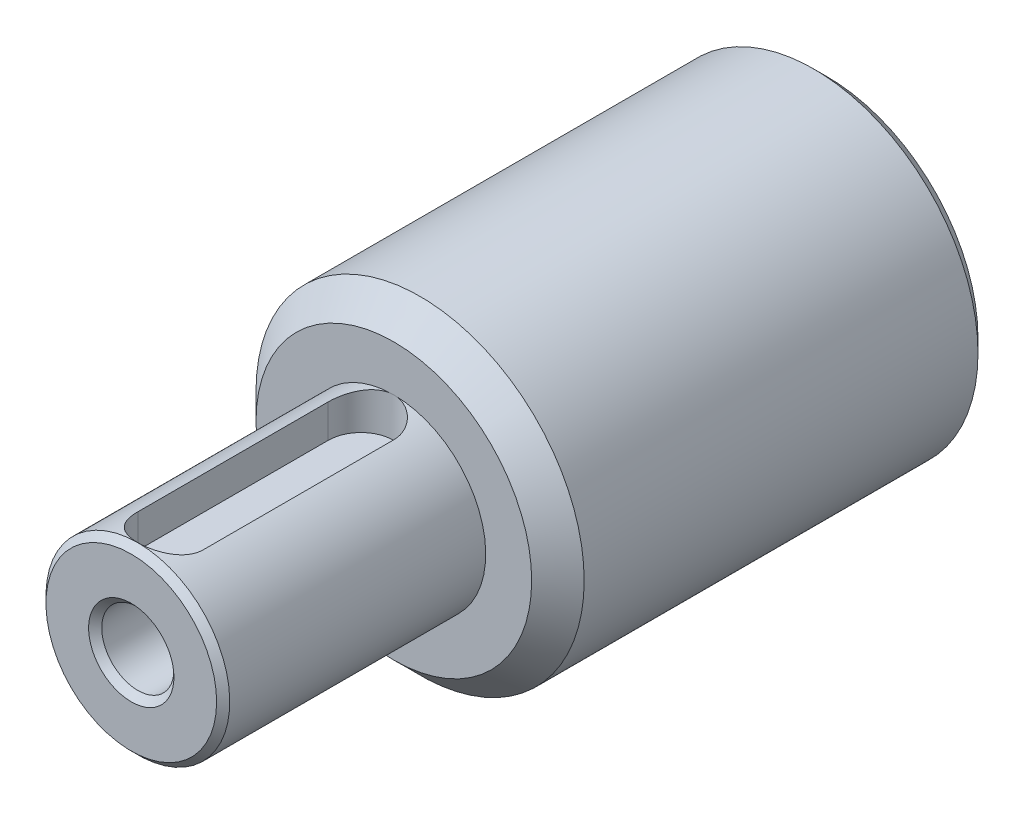
ISO-10303-21;
HEADER;
FILE_DESCRIPTION(('STEP AP214'),'2;1');
FILE_NAME('part.step','',(''),(''),'','','');
FILE_SCHEMA(('AUTOMOTIVE_DESIGN { 1 0 10303 214 1 1 1 1 }'));
ENDSEC;
DATA;
#1=APPLICATION_CONTEXT('core data for automotive mechanical design processes');
#2=APPLICATION_PROTOCOL_DEFINITION('international standard','automotive_design',2000,#1);
#3=PRODUCT_CONTEXT('',#1,'mechanical');
#4=PRODUCT('Part','Part','',(#3));
#5=PRODUCT_RELATED_PRODUCT_CATEGORY('part','',(#4));
#6=PRODUCT_DEFINITION_FORMATION('','',#4);
#7=PRODUCT_DEFINITION_CONTEXT('part definition',#1,'design');
#8=PRODUCT_DEFINITION('design','',#6,#7);
#9=PRODUCT_DEFINITION_SHAPE('','',#8);
#10=(LENGTH_UNIT() NAMED_UNIT(*) SI_UNIT(.MILLI.,.METRE.));
#11=(NAMED_UNIT(*) PLANE_ANGLE_UNIT() SI_UNIT($,.RADIAN.));
#12=(NAMED_UNIT(*) SI_UNIT($,.STERADIAN.) SOLID_ANGLE_UNIT());
#13=UNCERTAINTY_MEASURE_WITH_UNIT(LENGTH_MEASURE(1.E-05),#10,'distance_accuracy_value','');
#14=(GEOMETRIC_REPRESENTATION_CONTEXT(3) GLOBAL_UNCERTAINTY_ASSIGNED_CONTEXT((#13)) GLOBAL_UNIT_ASSIGNED_CONTEXT((#10,
#11,#12)) REPRESENTATION_CONTEXT('',''));
#15=CARTESIAN_POINT('',(0.,0.,0.));
#16=DIRECTION('',(0.,0.,1.));
#17=DIRECTION('',(1.,0.,0.));
#18=AXIS2_PLACEMENT_3D('',#15,#16,#17);
#19=CARTESIAN_POINT('',(0.,0.,33.));
#20=DIRECTION('',(0.,0.,1.));
#21=DIRECTION('',(1.,0.,0.));
#22=AXIS2_PLACEMENT_3D('',#19,#20,#21);
#23=PLANE('',#22);
#24=CARTESIAN_POINT('',(0.,0.,33.));
#25=DIRECTION('',(0.,0.,1.));
#26=DIRECTION('',(1.,0.,0.));
#27=AXIS2_PLACEMENT_3D('',#24,#25,#26);
#28=CIRCLE('',#27,10.5);
#29=CARTESIAN_POINT('',(10.5,0.,33.));
#30=VERTEX_POINT('',#29);
#31=EDGE_CURVE('E172',#30,#30,#28,.T.);
#32=ORIENTED_EDGE('',*,*,#31,.T.);
#33=EDGE_LOOP('',(#32));
#34=FACE_BOUND('',#33,.T.);
#35=CARTESIAN_POINT('',(0.,0.,33.));
#36=DIRECTION('',(0.,0.,1.));
#37=DIRECTION('',(1.,0.,0.));
#38=AXIS2_PLACEMENT_3D('',#35,#36,#37);
#39=CIRCLE('',#38,7.);
#40=CARTESIAN_POINT('',(0.,7.,33.));
#41=VERTEX_POINT('',#40);
#42=EDGE_CURVE('E161',#41,#41,#39,.T.);
#43=ORIENTED_EDGE('',*,*,#42,.F.);
#44=EDGE_LOOP('',(#43));
#45=FACE_BOUND('',#44,.T.);
#46=ADVANCED_FACE('F36',(#34,#45),#23,.T.);
#47=CARTESIAN_POINT('',(0.,0.,33.));
#48=DIRECTION('',(0.,0.,-1.));
#49=DIRECTION('',(-1.,0.,0.));
#50=AXIS2_PLACEMENT_3D('',#47,#48,#49);
#51=CYLINDRICAL_SURFACE('',#50,12.5);
#52=CARTESIAN_POINT('',(0.,0.,0.999999999999987));
#53=DIRECTION('',(0.,0.,1.));
#54=DIRECTION('',(1.,0.,0.));
#55=AXIS2_PLACEMENT_3D('',#52,#53,#54);
#56=CIRCLE('',#55,12.5);
#57=CARTESIAN_POINT('',(12.5,0.,0.999999999999987));
#58=VERTEX_POINT('',#57);
#59=EDGE_CURVE('E310',#58,#58,#56,.T.);
#60=ORIENTED_EDGE('',*,*,#59,.T.);
#61=EDGE_LOOP('',(#60));
#62=FACE_BOUND('',#61,.T.);
#63=CARTESIAN_POINT('',(0.,0.,31.));
#64=DIRECTION('',(0.,0.,1.));
#65=DIRECTION('',(1.,0.,0.));
#66=AXIS2_PLACEMENT_3D('',#63,#64,#65);
#67=CIRCLE('',#66,12.5);
#68=CARTESIAN_POINT('',(12.5,0.,31.));
#69=VERTEX_POINT('',#68);
#70=EDGE_CURVE('E175',#69,#69,#67,.F.);
#71=ORIENTED_EDGE('',*,*,#70,.T.);
#72=EDGE_LOOP('',(#71));
#73=FACE_BOUND('',#72,.T.);
#74=ADVANCED_FACE('F229',(#62,#73),#51,.T.);
#75=CARTESIAN_POINT('',(0.,0.,0.));
#76=DIRECTION('',(0.,0.,1.));
#77=DIRECTION('',(1.,0.,0.));
#78=AXIS2_PLACEMENT_3D('',#75,#76,#77);
#79=PLANE('',#78);
#80=DIRECTION('',(0.,1.,0.));
#81=VECTOR('',#80,1.);
#82=CARTESIAN_POINT('',(-2.5,9.,0.));
#83=LINE('',#82,#81);
#84=CARTESIAN_POINT('',(-2.5,7.07106781186547,0.));
#85=VERTEX_POINT('',#84);
#86=CARTESIAN_POINT('',(-2.5,9.,0.));
#87=VERTEX_POINT('',#86);
#88=EDGE_CURVE('E127',#85,#87,#83,.T.);
#89=ORIENTED_EDGE('',*,*,#88,.F.);
#90=CARTESIAN_POINT('',(0.,0.,0.));
#91=DIRECTION('',(0.,0.,1.));
#92=DIRECTION('',(1.,0.,0.));
#93=AXIS2_PLACEMENT_3D('',#90,#91,#92);
#94=CIRCLE('',#93,7.5);
#95=CARTESIAN_POINT('',(2.5,7.07106781186548,0.));
#96=VERTEX_POINT('',#95);
#97=EDGE_CURVE('E51',#85,#96,#94,.T.);
#98=ORIENTED_EDGE('',*,*,#97,.T.);
#99=DIRECTION('',(0.,-1.,0.));
#100=VECTOR('',#99,1.);
#101=CARTESIAN_POINT('',(2.5,9.,0.));
#102=LINE('',#101,#100);
#103=CARTESIAN_POINT('',(2.5,9.,0.));
#104=VERTEX_POINT('',#103);
#105=EDGE_CURVE('E138',#104,#96,#102,.T.);
#106=ORIENTED_EDGE('',*,*,#105,.F.);
#107=DIRECTION('',(1.,0.,0.));
#108=VECTOR('',#107,1.);
#109=CARTESIAN_POINT('',(2.5,9.,0.));
#110=LINE('',#109,#108);
#111=EDGE_CURVE('E142',#87,#104,#110,.T.);
#112=ORIENTED_EDGE('',*,*,#111,.F.);
#113=EDGE_LOOP('',(#89,#98,#106,#112));
#114=FACE_BOUND('',#113,.T.);
#115=CARTESIAN_POINT('',(0.,0.,0.));
#116=DIRECTION('',(0.,0.,1.));
#117=DIRECTION('',(1.,0.,0.));
#118=AXIS2_PLACEMENT_3D('',#115,#116,#117);
#119=CIRCLE('',#118,11.5);
#120=CARTESIAN_POINT('',(11.5,0.,0.));
#121=VERTEX_POINT('',#120);
#122=EDGE_CURVE('E313',#121,#121,#119,.F.);
#123=ORIENTED_EDGE('',*,*,#122,.T.);
#124=EDGE_LOOP('',(#123));
#125=FACE_BOUND('',#124,.T.);
#126=ADVANCED_FACE('F224',(#114,#125),#79,.F.);
#127=CARTESIAN_POINT('',(0.,0.,53.));
#128=DIRECTION('',(0.,0.,-1.));
#129=DIRECTION('',(-1.,0.,0.));
#130=AXIS2_PLACEMENT_3D('',#127,#128,#129);
#131=CYLINDRICAL_SURFACE('',#130,7.);
#132=CARTESIAN_POINT('',(2.5,6.53834841531101,50.));
#133=CARTESIAN_POINT('',(2.50000932220903,6.53833653785133,50.0678892457289));
#134=CARTESIAN_POINT('',(2.49723485076694,6.53940549922738,50.1357719326391));
#135=CARTESIAN_POINT('',(2.4861910211816,6.54361657478134,50.2710039106114));
#136=CARTESIAN_POINT('',(2.47792334551208,6.54675805418062,50.3383533586061));
#137=CARTESIAN_POINT('',(2.456001752859,6.55501217637942,50.4718214146028));
#138=CARTESIAN_POINT('',(2.44236559963955,6.56011831705676,50.5379433363398));
#139=CARTESIAN_POINT('',(2.40985115466648,6.57213177854175,50.6687018351085));
#140=CARTESIAN_POINT('',(2.39097263107435,6.57903917900746,50.7333383463124));
#141=CARTESIAN_POINT('',(2.32673964179204,6.6021493436571,50.9242643664775));
#142=CARTESIAN_POINT('',(2.27375112606986,6.62075475340844,51.0477904521356));
#143=CARTESIAN_POINT('',(2.14910757865425,6.6622539736071,51.284230333128));
#144=CARTESIAN_POINT('',(2.07743895048849,6.68515090424876,51.3971363167355));
#145=CARTESIAN_POINT('',(1.9140257110197,6.73379913792224,51.6142152133527));
#146=CARTESIAN_POINT('',(1.82158337146744,6.75962864041371,51.7178464751959));
#147=CARTESIAN_POINT('',(1.6207338877633,6.81057592323031,51.9085087047164));
#148=CARTESIAN_POINT('',(1.51232377552673,6.83569357019868,51.9955365792434));
#149=CARTESIAN_POINT('',(1.27853915335934,6.88331133279046,52.153089855455));
#150=CARTESIAN_POINT('',(1.15274833789185,6.90570835223797,52.2230315218605));
#151=CARTESIAN_POINT('',(0.890250825476636,6.94442357672633,52.3405366467974));
#152=CARTESIAN_POINT('',(0.753547890540328,6.96074386585465,52.388107779046));
#153=CARTESIAN_POINT('',(0.478829979256176,6.9849105051071,52.4576406021824));
#154=CARTESIAN_POINT('',(0.341079835227467,6.99306594352515,52.4805391304711));
#155=CARTESIAN_POINT('',(0.063464305296903,7.00108798053822,52.5030684027777));
#156=CARTESIAN_POINT('',(-0.0764004845074496,7.00095687302702,52.5027055860347));
#157=CARTESIAN_POINT('',(-0.347593258486948,6.99262258049077,52.4792887262389));
#158=CARTESIAN_POINT('',(-0.479022407078722,6.98478243583516,52.4572552058015));
#159=CARTESIAN_POINT('',(-0.736175812143609,6.96237832507347,52.3928265758412));
#160=CARTESIAN_POINT('',(-0.861899745780465,6.94781397899037,52.3504303156375));
#161=CARTESIAN_POINT('',(-1.10616102429807,6.91316506890369,52.2459530884347));
#162=CARTESIAN_POINT('',(-1.22457279066906,6.89300592164314,52.1836042850399));
#163=CARTESIAN_POINT('',(-1.44953531305523,6.8492335561632,52.0412206647766));
#164=CARTESIAN_POINT('',(-1.55608245176771,6.82561928959263,51.9611804762164));
#165=CARTESIAN_POINT('',(-1.7603244525607,6.7759054780549,51.7806767363433));
#166=CARTESIAN_POINT('',(-1.85724185700418,6.74974055843875,51.6793502768551));
#167=CARTESIAN_POINT('',(-2.03299914621296,6.69890342468975,51.4616726358344));
#168=CARTESIAN_POINT('',(-2.11183255456462,6.67423174765257,51.3453160948315));
#169=CARTESIAN_POINT('',(-2.25049860898459,6.62877803875405,51.098057401478));
#170=CARTESIAN_POINT('',(-2.30994207989625,6.60807875118994,50.9669210244946));
#171=CARTESIAN_POINT('',(-2.4055543972585,6.57388213610267,50.6956351984178));
#172=CARTESIAN_POINT('',(-2.44176119399954,6.56037307165053,50.555500858831));
#173=CARTESIAN_POINT('',(-2.47705497148627,6.54708542245562,50.3449694557358));
#174=CARTESIAN_POINT('',(-2.48565347586445,6.54382010967907,50.2762636982282));
#175=CARTESIAN_POINT('',(-2.49712352174882,6.53944910829676,50.1383848358083));
#176=CARTESIAN_POINT('',(-2.50000139665367,6.53834103140935,50.0692123328995));
#177=CARTESIAN_POINT('',(-2.5,6.53834841531101,50.));
#178=B_SPLINE_CURVE_WITH_KNOTS('',3,(#132,#133,#134,#135,#136,#137,#138,#139,#140,#141,#142,
#143,#144,#145,#146,#147,#148,#149,#150,#151,#152,#153,#154,#155,#156,#157,#158,#159,#160,#161,
#162,#163,#164,#165,#166,#167,#168,#169,#170,#171,#172,#173,#174,#175,#176,#177),.UNSPECIFIED.,
.F.,.F.,(4,2,2,2,2,2,2,2,2,2,2,2,2,2,2,2,2,2,2,2,2,2,4),(0.,0.203591628551592,0.407120929225535,
0.609982356545741,0.812852756635989,1.21793118555512,1.6233052814847,2.0451597231193,
2.4670926781184,2.90188398965561,3.33652604665237,3.75400993940861,4.17137826416923,
4.56998920861347,4.96862268086888,5.3728490944864,5.77719841367921,6.20315837945088,
6.6292706567472,7.06347329058504,7.49696496492444,7.70468580162773,7.91217653896404),.UNSPECIFIED.);
#179=CARTESIAN_POINT('',(2.5,6.53834841531101,50.));
#180=VERTEX_POINT('',#179);
#181=CARTESIAN_POINT('',(-2.71449623025347E-13,7.00000000000099,52.5000000000028));
#182=VERTEX_POINT('',#181);
#183=EDGE_CURVE('E188',#180,#182,#178,.T.);
#184=ORIENTED_EDGE('',*,*,#183,.T.);
#185=CARTESIAN_POINT('',(0.,0.,52.5));
#186=DIRECTION('',(0.,0.,1.));
#187=DIRECTION('',(1.,0.,0.));
#188=AXIS2_PLACEMENT_3D('',#185,#186,#187);
#189=CIRCLE('',#188,7.);
#190=EDGE_CURVE('E307',#182,#182,#189,.F.);
#191=ORIENTED_EDGE('',*,*,#190,.T.);
#192=CARTESIAN_POINT('',(-2.5,6.53834841531101,50.));
#193=VERTEX_POINT('',#192);
#194=EDGE_CURVE('E186',#182,#193,#178,.T.);
#195=ORIENTED_EDGE('',*,*,#194,.T.);
#196=DIRECTION('',(0.,0.,-1.));
#197=VECTOR('',#196,1.);
#198=CARTESIAN_POINT('',(-2.5,6.53834841531101,53.));
#199=LINE('',#198,#197);
#200=CARTESIAN_POINT('',(-2.5,6.53834841531101,35.5));
#201=VERTEX_POINT('',#200);
#202=EDGE_CURVE('E300',#193,#201,#199,.T.);
#203=ORIENTED_EDGE('',*,*,#202,.T.);
#204=CARTESIAN_POINT('',(-2.5,6.53834841531101,35.5));
#205=CARTESIAN_POINT('',(-2.50000932220904,6.53833653785133,35.4321107542711));
#206=CARTESIAN_POINT('',(-2.49723485076694,6.53940549922738,35.3642280673609));
#207=CARTESIAN_POINT('',(-2.4861910211816,6.54361657478134,35.2289960893886));
#208=CARTESIAN_POINT('',(-2.47792334551208,6.54675805418062,35.1616466413939));
#209=CARTESIAN_POINT('',(-2.456001752859,6.55501217637942,35.0281785853972));
#210=CARTESIAN_POINT('',(-2.44236559963955,6.56011831705676,34.9620566636602));
#211=CARTESIAN_POINT('',(-2.40985115466648,6.57213177854175,34.8312981648915));
#212=CARTESIAN_POINT('',(-2.39097263107436,6.57903917900746,34.7666616536876));
#213=CARTESIAN_POINT('',(-2.32673964179205,6.60214934365709,34.5757356335225));
#214=CARTESIAN_POINT('',(-2.27375112606986,6.62075475340844,34.4522095478644));
#215=CARTESIAN_POINT('',(-2.14910757865425,6.6622539736071,34.215769666872));
#216=CARTESIAN_POINT('',(-2.07743895048849,6.68515090424876,34.1028636832645));
#217=CARTESIAN_POINT('',(-1.9140257110197,6.73379913792224,33.8857847866473));
#218=CARTESIAN_POINT('',(-1.82158337146744,6.75962864041371,33.7821535248041));
#219=CARTESIAN_POINT('',(-1.6207338877633,6.81057592323031,33.5914912952836));
#220=CARTESIAN_POINT('',(-1.51232377552674,6.83569357019868,33.5044634207567));
#221=CARTESIAN_POINT('',(-1.27853915335935,6.88331133279046,33.346910144545));
#222=CARTESIAN_POINT('',(-1.15274833789185,6.90570835223797,33.2769684781395));
#223=CARTESIAN_POINT('',(-0.890250825476637,6.94442357672633,33.1594633532026));
#224=CARTESIAN_POINT('',(-0.753547890540329,6.96074386585465,33.111892220954));
#225=CARTESIAN_POINT('',(-0.478829979256176,6.9849105051071,33.0423593978176));
#226=CARTESIAN_POINT('',(-0.341079835227467,6.99306594352515,33.0194608695289));
#227=CARTESIAN_POINT('',(-0.0634643052969033,7.00108798053822,32.9969315972224));
#228=CARTESIAN_POINT('',(0.0764004845074492,7.00095687302702,32.9972944139653));
#229=CARTESIAN_POINT('',(0.347593258486947,6.99262258049077,33.0207112737611));
#230=CARTESIAN_POINT('',(0.479022407078721,6.98478243583516,33.0427447941985));
#231=CARTESIAN_POINT('',(0.736175812143608,6.96237832507347,33.1071734241588));
#232=CARTESIAN_POINT('',(0.861899745780465,6.94781397899037,33.1495696843625));
#233=CARTESIAN_POINT('',(1.10616102429807,6.91316506890369,33.2540469115653));
#234=CARTESIAN_POINT('',(1.22457279066906,6.89300592164314,33.3163957149601));
#235=CARTESIAN_POINT('',(1.44953531305523,6.8492335561632,33.4587793352234));
#236=CARTESIAN_POINT('',(1.55608245176771,6.82561928959263,33.5388195237836));
#237=CARTESIAN_POINT('',(1.7603244525607,6.7759054780549,33.7193232636567));
#238=CARTESIAN_POINT('',(1.85724185700418,6.74974055843875,33.8206497231449));
#239=CARTESIAN_POINT('',(2.03299914621296,6.69890342468975,34.0383273641656));
#240=CARTESIAN_POINT('',(2.11183255456462,6.67423174765257,34.1546839051685));
#241=CARTESIAN_POINT('',(2.25049860898459,6.62877803875405,34.401942598522));
#242=CARTESIAN_POINT('',(2.30994207989626,6.60807875118994,34.5330789755054));
#243=CARTESIAN_POINT('',(2.4055543972585,6.57388213610267,34.8043648015822));
#244=CARTESIAN_POINT('',(2.44176119399954,6.56037307165053,34.944499141169));
#245=CARTESIAN_POINT('',(2.47705497148627,6.54708542245562,35.1550305442642));
#246=CARTESIAN_POINT('',(2.48565347586445,6.54382010967907,35.2237363017718));
#247=CARTESIAN_POINT('',(2.49712352174882,6.53944910829676,35.3616151641917));
#248=CARTESIAN_POINT('',(2.50000139665367,6.53834103140935,35.4307876671005));
#249=CARTESIAN_POINT('',(2.5,6.53834841531101,35.5));
#250=B_SPLINE_CURVE_WITH_KNOTS('',3,(#204,#205,#206,#207,#208,#209,#210,#211,#212,#213,#214,
#215,#216,#217,#218,#219,#220,#221,#222,#223,#224,#225,#226,#227,#228,#229,#230,#231,#232,#233,
#234,#235,#236,#237,#238,#239,#240,#241,#242,#243,#244,#245,#246,#247,#248,#249),.UNSPECIFIED.,
.F.,.F.,(4,2,2,2,2,2,2,2,2,2,2,2,2,2,2,2,2,2,2,2,2,2,4),(0.,0.203591628551592,0.407120929225535,
0.609982356545741,0.812852756635989,1.21793118555512,1.6233052814847,2.0451597231193,
2.4670926781184,2.90188398965561,3.33652604665238,3.75400993940862,4.17137826416923,
4.56998920861347,4.96862268086888,5.37284909448639,5.77719841367922,6.20315837945088,
6.62927065674721,7.06347329058505,7.49696496492445,7.70468580162774,7.91217653896405),.UNSPECIFIED.);
#251=EDGE_CURVE('E187',#201,#41,#250,.T.);
#252=ORIENTED_EDGE('',*,*,#251,.T.);
#253=ORIENTED_EDGE('',*,*,#42,.T.);
#254=CARTESIAN_POINT('',(2.5,6.53834841531101,35.5));
#255=VERTEX_POINT('',#254);
#256=EDGE_CURVE('E178',#41,#255,#250,.T.);
#257=ORIENTED_EDGE('',*,*,#256,.T.);
#258=DIRECTION('',(0.,0.,-1.));
#259=VECTOR('',#258,1.);
#260=CARTESIAN_POINT('',(2.5,6.53834841531101,53.));
#261=LINE('',#260,#259);
#262=EDGE_CURVE('E296',#255,#180,#261,.F.);
#263=ORIENTED_EDGE('',*,*,#262,.T.);
#264=EDGE_LOOP('',(#184,#191,#195,#203,#252,#253,#257,#263));
#265=FACE_BOUND('',#264,.T.);
#266=ADVANCED_FACE('F194',(#265),#131,.T.);
#267=CARTESIAN_POINT('',(0.,0.,53.));
#268=DIRECTION('',(0.,0.,1.));
#269=DIRECTION('',(1.,0.,0.));
#270=AXIS2_PLACEMENT_3D('',#267,#268,#269);
#271=PLANE('',#270);
#272=CARTESIAN_POINT('',(0.,0.,53.));
#273=DIRECTION('',(0.,0.,1.));
#274=DIRECTION('',(1.,0.,0.));
#275=AXIS2_PLACEMENT_3D('',#272,#273,#274);
#276=CIRCLE('',#275,3.25000000000002);
#277=CARTESIAN_POINT('',(3.25000000000002,0.,53.));
#278=VERTEX_POINT('',#277);
#279=EDGE_CURVE('E525',#278,#278,#276,.F.);
#280=ORIENTED_EDGE('',*,*,#279,.T.);
#281=EDGE_LOOP('',(#280));
#282=FACE_BOUND('',#281,.T.);
#283=CARTESIAN_POINT('',(0.,0.,53.));
#284=DIRECTION('',(0.,0.,1.));
#285=DIRECTION('',(1.,0.,0.));
#286=AXIS2_PLACEMENT_3D('',#283,#284,#285);
#287=CIRCLE('',#286,6.50000000000001);
#288=CARTESIAN_POINT('',(6.50000000000001,0.,53.));
#289=VERTEX_POINT('',#288);
#290=EDGE_CURVE('E303',#289,#289,#287,.T.);
#291=ORIENTED_EDGE('',*,*,#290,.T.);
#292=EDGE_LOOP('',(#291));
#293=FACE_BOUND('',#292,.T.);
#294=ADVANCED_FACE('F215',(#282,#293),#271,.T.);
#295=CARTESIAN_POINT('',(0.,0.,33.));
#296=DIRECTION('',(0.,0.,-1.));
#297=DIRECTION('',(-1.,0.,0.));
#298=AXIS2_PLACEMENT_3D('',#295,#296,#297);
#299=CONICAL_SURFACE('',#298,10.5,0.785398163397448);
#300=ORIENTED_EDGE('',*,*,#70,.F.);
#301=EDGE_LOOP('',(#300));
#302=FACE_BOUND('',#301,.T.);
#303=ORIENTED_EDGE('',*,*,#31,.F.);
#304=EDGE_LOOP('',(#303));
#305=FACE_BOUND('',#304,.T.);
#306=ADVANCED_FACE('F213',(#302,#305),#299,.T.);
#307=CARTESIAN_POINT('',(0.,4.,50.));
#308=DIRECTION('',(0.,1.,0.));
#309=DIRECTION('',(0.,0.,1.));
#310=AXIS2_PLACEMENT_3D('',#307,#308,#309);
#311=CYLINDRICAL_SURFACE('',#310,2.5);
#312=DIRECTION('',(0.,1.,0.));
#313=VECTOR('',#312,1.);
#314=CARTESIAN_POINT('',(2.5,4.,50.));
#315=LINE('',#314,#313);
#316=CARTESIAN_POINT('',(2.5,4.,50.));
#317=VERTEX_POINT('',#316);
#318=EDGE_CURVE('E157',#317,#180,#315,.T.);
#319=ORIENTED_EDGE('',*,*,#318,.F.);
#320=CARTESIAN_POINT('',(0.,4.,50.));
#321=DIRECTION('',(0.,1.,0.));
#322=DIRECTION('',(0.,0.,1.));
#323=AXIS2_PLACEMENT_3D('',#320,#321,#322);
#324=CIRCLE('',#323,2.5);
#325=CARTESIAN_POINT('',(-2.5,4.,50.));
#326=VERTEX_POINT('',#325);
#327=EDGE_CURVE('E144',#326,#317,#324,.T.);
#328=ORIENTED_EDGE('',*,*,#327,.F.);
#329=DIRECTION('',(0.,1.,0.));
#330=VECTOR('',#329,1.);
#331=CARTESIAN_POINT('',(-2.5,4.,50.));
#332=LINE('',#331,#330);
#333=EDGE_CURVE('E158',#326,#193,#332,.T.);
#334=ORIENTED_EDGE('',*,*,#333,.T.);
#335=ORIENTED_EDGE('',*,*,#194,.F.);
#336=ORIENTED_EDGE('',*,*,#183,.F.);
#337=EDGE_LOOP('',(#319,#328,#334,#335,#336));
#338=FACE_BOUND('',#337,.T.);
#339=ADVANCED_FACE('F210',(#338),#311,.F.);
#340=CARTESIAN_POINT('',(-2.5,4.,50.));
#341=DIRECTION('',(-1.,0.,0.));
#342=DIRECTION('',(0.,0.,1.));
#343=AXIS2_PLACEMENT_3D('',#340,#341,#342);
#344=PLANE('',#343);
#345=ORIENTED_EDGE('',*,*,#333,.F.);
#346=DIRECTION('',(0.,0.,1.));
#347=VECTOR('',#346,1.);
#348=CARTESIAN_POINT('',(-2.5,4.,50.));
#349=LINE('',#348,#347);
#350=CARTESIAN_POINT('',(-2.5,4.,35.5));
#351=VERTEX_POINT('',#350);
#352=EDGE_CURVE('E154',#351,#326,#349,.T.);
#353=ORIENTED_EDGE('',*,*,#352,.F.);
#354=DIRECTION('',(0.,1.,0.));
#355=VECTOR('',#354,1.);
#356=CARTESIAN_POINT('',(-2.5,4.,35.5));
#357=LINE('',#356,#355);
#358=EDGE_CURVE('E162',#351,#201,#357,.T.);
#359=ORIENTED_EDGE('',*,*,#358,.T.);
#360=ORIENTED_EDGE('',*,*,#202,.F.);
#361=EDGE_LOOP('',(#345,#353,#359,#360));
#362=FACE_BOUND('',#361,.T.);
#363=ADVANCED_FACE('F204',(#362),#344,.F.);
#364=CARTESIAN_POINT('',(0.,4.,35.5));
#365=DIRECTION('',(0.,1.,0.));
#366=DIRECTION('',(0.,0.,1.));
#367=AXIS2_PLACEMENT_3D('',#364,#365,#366);
#368=CYLINDRICAL_SURFACE('',#367,2.5);
#369=ORIENTED_EDGE('',*,*,#358,.F.);
#370=CARTESIAN_POINT('',(0.,4.,35.5));
#371=DIRECTION('',(0.,1.,0.));
#372=DIRECTION('',(0.,0.,1.));
#373=AXIS2_PLACEMENT_3D('',#370,#371,#372);
#374=CIRCLE('',#373,2.5);
#375=CARTESIAN_POINT('',(2.5,4.,35.5));
#376=VERTEX_POINT('',#375);
#377=EDGE_CURVE('E151',#376,#351,#374,.T.);
#378=ORIENTED_EDGE('',*,*,#377,.F.);
#379=DIRECTION('',(0.,1.,0.));
#380=VECTOR('',#379,1.);
#381=CARTESIAN_POINT('',(2.5,4.,35.5));
#382=LINE('',#381,#380);
#383=EDGE_CURVE('E165',#376,#255,#382,.T.);
#384=ORIENTED_EDGE('',*,*,#383,.T.);
#385=ORIENTED_EDGE('',*,*,#256,.F.);
#386=ORIENTED_EDGE('',*,*,#251,.F.);
#387=EDGE_LOOP('',(#369,#378,#384,#385,#386));
#388=FACE_BOUND('',#387,.T.);
#389=ADVANCED_FACE('F198',(#388),#368,.F.);
#390=CARTESIAN_POINT('',(2.5,4.,50.));
#391=DIRECTION('',(1.,0.,0.));
#392=DIRECTION('',(0.,0.,-1.));
#393=AXIS2_PLACEMENT_3D('',#390,#391,#392);
#394=PLANE('',#393);
#395=ORIENTED_EDGE('',*,*,#383,.F.);
#396=DIRECTION('',(0.,0.,-1.));
#397=VECTOR('',#396,1.);
#398=CARTESIAN_POINT('',(2.5,4.,50.));
#399=LINE('',#398,#397);
#400=EDGE_CURVE('E148',#317,#376,#399,.T.);
#401=ORIENTED_EDGE('',*,*,#400,.F.);
#402=ORIENTED_EDGE('',*,*,#318,.T.);
#403=ORIENTED_EDGE('',*,*,#262,.F.);
#404=EDGE_LOOP('',(#395,#401,#402,#403));
#405=FACE_BOUND('',#404,.T.);
#406=ADVANCED_FACE('F203',(#405),#394,.F.);
#407=CARTESIAN_POINT('',(0.,4.,50.));
#408=DIRECTION('',(0.,1.,0.));
#409=DIRECTION('',(0.,0.,1.));
#410=AXIS2_PLACEMENT_3D('',#407,#408,#409);
#411=PLANE('',#410);
#412=ORIENTED_EDGE('',*,*,#327,.T.);
#413=ORIENTED_EDGE('',*,*,#400,.T.);
#414=ORIENTED_EDGE('',*,*,#377,.T.);
#415=ORIENTED_EDGE('',*,*,#352,.T.);
#416=EDGE_LOOP('',(#412,#413,#414,#415));
#417=FACE_BOUND('',#416,.T.);
#418=ADVANCED_FACE('F208',(#417),#411,.T.);
#419=CARTESIAN_POINT('',(0.,0.,53.));
#420=DIRECTION('',(0.,0.,-1.));
#421=DIRECTION('',(-1.,0.,0.));
#422=AXIS2_PLACEMENT_3D('',#419,#420,#421);
#423=CONICAL_SURFACE('',#422,6.50000000000001,0.785398163397449);
#424=ORIENTED_EDGE('',*,*,#190,.F.);
#425=EDGE_LOOP('',(#424));
#426=FACE_BOUND('',#425,.T.);
#427=ORIENTED_EDGE('',*,*,#290,.F.);
#428=EDGE_LOOP('',(#427));
#429=FACE_BOUND('',#428,.T.);
#430=ADVANCED_FACE('F240',(#426,#429),#423,.T.);
#431=CARTESIAN_POINT('',(0.,0.,0.999999999999987));
#432=DIRECTION('',(0.,0.,1.));
#433=DIRECTION('',(1.,0.,0.));
#434=AXIS2_PLACEMENT_3D('',#431,#432,#433);
#435=CONICAL_SURFACE('',#434,12.5,0.785398163397454);
#436=ORIENTED_EDGE('',*,*,#122,.F.);
#437=EDGE_LOOP('',(#436));
#438=FACE_BOUND('',#437,.T.);
#439=ORIENTED_EDGE('',*,*,#59,.F.);
#440=EDGE_LOOP('',(#439));
#441=FACE_BOUND('',#440,.T.);
#442=ADVANCED_FACE('F243',(#438,#441),#435,.T.);
#443=CARTESIAN_POINT('',(0.,0.,28.));
#444=DIRECTION('',(0.,0.,-1.));
#445=DIRECTION('',(-1.,0.,0.));
#446=AXIS2_PLACEMENT_3D('',#443,#444,#445);
#447=CYLINDRICAL_SURFACE('',#446,7.);
#448=CARTESIAN_POINT('',(0.,0.,27.));
#449=DIRECTION('',(0.,0.,-1.));
#450=DIRECTION('',(-1.,0.,0.));
#451=AXIS2_PLACEMENT_3D('',#448,#449,#450);
#452=CIRCLE('',#451,7.);
#453=CARTESIAN_POINT('',(-7.,0.,27.));
#454=VERTEX_POINT('',#453);
#455=EDGE_CURVE('E11',#454,#454,#452,.F.);
#456=ORIENTED_EDGE('',*,*,#455,.T.);
#457=EDGE_LOOP('',(#456));
#458=FACE_BOUND('',#457,.T.);
#459=DIRECTION('',(0.,0.,-1.));
#460=VECTOR('',#459,1.);
#461=CARTESIAN_POINT('',(2.5,6.53834841531101,28.));
#462=LINE('',#461,#460);
#463=CARTESIAN_POINT('',(2.5,6.53834841531101,26.));
#464=VERTEX_POINT('',#463);
#465=CARTESIAN_POINT('',(2.5,6.53834841531101,0.500000000000012));
#466=VERTEX_POINT('',#465);
#467=EDGE_CURVE('E319',#464,#466,#462,.T.);
#468=ORIENTED_EDGE('',*,*,#467,.T.);
#469=CARTESIAN_POINT('',(0.,0.,0.500000000000011));
#470=DIRECTION('',(0.,0.,1.));
#471=DIRECTION('',(1.,0.,0.));
#472=AXIS2_PLACEMENT_3D('',#469,#470,#471);
#473=CIRCLE('',#472,7.);
#474=CARTESIAN_POINT('',(-2.5,6.53834841531101,0.500000000000011));
#475=VERTEX_POINT('',#474);
#476=EDGE_CURVE('E321',#466,#475,#473,.F.);
#477=ORIENTED_EDGE('',*,*,#476,.T.);
#478=DIRECTION('',(0.,0.,-1.));
#479=VECTOR('',#478,1.);
#480=CARTESIAN_POINT('',(-2.5,6.53834841531101,28.));
#481=LINE('',#480,#479);
#482=CARTESIAN_POINT('',(-2.5,6.53834841531101,26.));
#483=VERTEX_POINT('',#482);
#484=EDGE_CURVE('E317',#475,#483,#481,.F.);
#485=ORIENTED_EDGE('',*,*,#484,.T.);
#486=CARTESIAN_POINT('',(0.,0.,26.));
#487=DIRECTION('',(0.,0.,-1.));
#488=DIRECTION('',(-1.,0.,0.));
#489=AXIS2_PLACEMENT_3D('',#486,#487,#488);
#490=CIRCLE('',#489,7.);
#491=EDGE_CURVE('E121',#464,#483,#490,.F.);
#492=ORIENTED_EDGE('',*,*,#491,.F.);
#493=EDGE_LOOP('',(#468,#477,#485,#492));
#494=FACE_BOUND('',#493,.T.);
#495=ADVANCED_FACE('F247',(#458,#494),#447,.F.);
#496=CARTESIAN_POINT('',(0.,0.,28.));
#497=DIRECTION('',(0.,0.,-1.));
#498=DIRECTION('',(-1.,0.,0.));
#499=AXIS2_PLACEMENT_3D('',#496,#497,#498);
#500=PLANE('',#499);
#501=CARTESIAN_POINT('',(0.,0.,28.));
#502=DIRECTION('',(0.,0.,-1.));
#503=DIRECTION('',(-1.,0.,0.));
#504=AXIS2_PLACEMENT_3D('',#501,#502,#503);
#505=CIRCLE('',#504,6.);
#506=CARTESIAN_POINT('',(-6.,0.,28.));
#507=VERTEX_POINT('',#506);
#508=EDGE_CURVE('E44',#507,#507,#505,.T.);
#509=ORIENTED_EDGE('',*,*,#508,.T.);
#510=EDGE_LOOP('',(#509));
#511=FACE_BOUND('',#510,.T.);
#512=CARTESIAN_POINT('',(0.,0.,28.));
#513=DIRECTION('',(0.,0.,-1.));
#514=DIRECTION('',(-1.,0.,0.));
#515=AXIS2_PLACEMENT_3D('',#512,#513,#514);
#516=CIRCLE('',#515,2.75);
#517=CARTESIAN_POINT('',(-2.75,0.,28.));
#518=VERTEX_POINT('',#517);
#519=EDGE_CURVE('E140',#518,#518,#516,.T.);
#520=ORIENTED_EDGE('',*,*,#519,.F.);
#521=EDGE_LOOP('',(#520));
#522=FACE_BOUND('',#521,.T.);
#523=ADVANCED_FACE('F276',(#511,#522),#500,.T.);
#524=CARTESIAN_POINT('',(2.5,9.,26.));
#525=DIRECTION('',(1.,0.,0.));
#526=DIRECTION('',(0.,0.,-1.));
#527=AXIS2_PLACEMENT_3D('',#524,#525,#526);
#528=PLANE('',#527);
#529=ORIENTED_EDGE('',*,*,#105,.T.);
#530=CARTESIAN_POINT('',(2.5,7.07106781186548,0.));
#531=CARTESIAN_POINT('',(2.5,6.98247505606886,0.0835398180439172));
#532=CARTESIAN_POINT('',(2.5,6.89378539719896,0.166976391794403));
#533=CARTESIAN_POINT('',(2.5,6.71621226503222,0.33364305848033));
#534=CARTESIAN_POINT('',(2.5,6.62732879171729,0.416873151396515));
#535=CARTESIAN_POINT('',(2.5,6.53834841531101,0.500000000000011));
#536=B_SPLINE_CURVE_WITH_KNOTS('',3,(#530,#531,#532,#533,#534,#535),.UNSPECIFIED.,.F.,.F.,(4,2,
4),(0.,0.365304882074012,0.73060979821703),.UNSPECIFIED.);
#537=EDGE_CURVE('E264',#96,#466,#536,.T.);
#538=ORIENTED_EDGE('',*,*,#537,.T.);
#539=ORIENTED_EDGE('',*,*,#467,.F.);
#540=DIRECTION('',(0.,-1.,0.));
#541=VECTOR('',#540,1.);
#542=CARTESIAN_POINT('',(2.5,9.,26.));
#543=LINE('',#542,#541);
#544=CARTESIAN_POINT('',(2.5,9.,26.));
#545=VERTEX_POINT('',#544);
#546=EDGE_CURVE('E122',#545,#464,#543,.T.);
#547=ORIENTED_EDGE('',*,*,#546,.F.);
#548=DIRECTION('',(0.,0.,-1.));
#549=VECTOR('',#548,1.);
#550=CARTESIAN_POINT('',(2.5,9.,26.));
#551=LINE('',#550,#549);
#552=EDGE_CURVE('E131',#545,#104,#551,.T.);
#553=ORIENTED_EDGE('',*,*,#552,.T.);
#554=EDGE_LOOP('',(#529,#538,#539,#547,#553));
#555=FACE_BOUND('',#554,.T.);
#556=ADVANCED_FACE('F272',(#555),#528,.F.);
#557=CARTESIAN_POINT('',(-2.5,9.,26.));
#558=DIRECTION('',(-1.,0.,0.));
#559=DIRECTION('',(0.,-1.,0.));
#560=AXIS2_PLACEMENT_3D('',#557,#558,#559);
#561=PLANE('',#560);
#562=ORIENTED_EDGE('',*,*,#484,.F.);
#563=CARTESIAN_POINT('',(-2.5,6.53834841531101,0.500000000000011));
#564=CARTESIAN_POINT('',(-2.5,6.62732879171729,0.416873151396515));
#565=CARTESIAN_POINT('',(-2.5,6.71621226503222,0.333643058480331));
#566=CARTESIAN_POINT('',(-2.5,6.89378539719896,0.166976391794403));
#567=CARTESIAN_POINT('',(-2.5,6.98247505606886,0.0835398180439173));
#568=CARTESIAN_POINT('',(-2.5,7.07106781186547,0.));
#569=B_SPLINE_CURVE_WITH_KNOTS('',3,(#563,#564,#565,#566,#567,#568),.UNSPECIFIED.,.F.,.F.,(4,2,
4),(0.,0.365304916143019,0.73060979821703),.UNSPECIFIED.);
#570=EDGE_CURVE('E59',#475,#85,#569,.T.);
#571=ORIENTED_EDGE('',*,*,#570,.T.);
#572=ORIENTED_EDGE('',*,*,#88,.T.);
#573=DIRECTION('',(0.,0.,-1.));
#574=VECTOR('',#573,1.);
#575=CARTESIAN_POINT('',(-2.5,9.,26.));
#576=LINE('',#575,#574);
#577=CARTESIAN_POINT('',(-2.5,9.,26.));
#578=VERTEX_POINT('',#577);
#579=EDGE_CURVE('E125',#578,#87,#576,.T.);
#580=ORIENTED_EDGE('',*,*,#579,.F.);
#581=DIRECTION('',(0.,1.,0.));
#582=VECTOR('',#581,1.);
#583=CARTESIAN_POINT('',(-2.5,9.,26.));
#584=LINE('',#583,#582);
#585=EDGE_CURVE('E115',#483,#578,#584,.T.);
#586=ORIENTED_EDGE('',*,*,#585,.F.);
#587=EDGE_LOOP('',(#562,#571,#572,#580,#586));
#588=FACE_BOUND('',#587,.T.);
#589=ADVANCED_FACE('F126',(#588),#561,.F.);
#590=CARTESIAN_POINT('',(2.5,4.33231396534167,26.));
#591=DIRECTION('',(0.,0.,-1.));
#592=DIRECTION('',(-1.,0.,0.));
#593=AXIS2_PLACEMENT_3D('',#590,#591,#592);
#594=PLANE('',#593);
#595=ORIENTED_EDGE('',*,*,#491,.T.);
#596=ORIENTED_EDGE('',*,*,#585,.T.);
#597=DIRECTION('',(1.,0.,0.));
#598=VECTOR('',#597,1.);
#599=CARTESIAN_POINT('',(2.5,9.,26.));
#600=LINE('',#599,#598);
#601=EDGE_CURVE('E119',#578,#545,#600,.T.);
#602=ORIENTED_EDGE('',*,*,#601,.T.);
#603=ORIENTED_EDGE('',*,*,#546,.T.);
#604=EDGE_LOOP('',(#595,#596,#602,#603));
#605=FACE_BOUND('',#604,.T.);
#606=ADVANCED_FACE('F117',(#605),#594,.T.);
#607=CARTESIAN_POINT('',(2.5,9.,26.));
#608=DIRECTION('',(0.,1.,0.));
#609=DIRECTION('',(0.,0.,1.));
#610=AXIS2_PLACEMENT_3D('',#607,#608,#609);
#611=PLANE('',#610);
#612=ORIENTED_EDGE('',*,*,#111,.T.);
#613=ORIENTED_EDGE('',*,*,#552,.F.);
#614=ORIENTED_EDGE('',*,*,#601,.F.);
#615=ORIENTED_EDGE('',*,*,#579,.T.);
#616=EDGE_LOOP('',(#612,#613,#614,#615));
#617=FACE_BOUND('',#616,.T.);
#618=ADVANCED_FACE('F133',(#617),#611,.F.);
#619=CARTESIAN_POINT('',(0.,0.,0.500000000000011));
#620=DIRECTION('',(0.,0.,-1.));
#621=DIRECTION('',(-1.,0.,0.));
#622=AXIS2_PLACEMENT_3D('',#619,#620,#621);
#623=CONICAL_SURFACE('',#622,7.,0.785398163397437);
#624=ORIENTED_EDGE('',*,*,#537,.F.);
#625=ORIENTED_EDGE('',*,*,#97,.F.);
#626=ORIENTED_EDGE('',*,*,#570,.F.);
#627=ORIENTED_EDGE('',*,*,#476,.F.);
#628=EDGE_LOOP('',(#624,#625,#626,#627));
#629=FACE_BOUND('',#628,.T.);
#630=ADVANCED_FACE('F249',(#629),#623,.F.);
#631=CARTESIAN_POINT('',(0.,0.,3.));
#632=DIRECTION('',(0.,0.,1.));
#633=DIRECTION('',(1.,0.,0.));
#634=AXIS2_PLACEMENT_3D('',#631,#632,#633);
#635=CYLINDRICAL_SURFACE('',#634,2.75);
#636=CARTESIAN_POINT('',(0.,0.,52.5));
#637=DIRECTION('',(0.,0.,1.));
#638=DIRECTION('',(1.,0.,0.));
#639=AXIS2_PLACEMENT_3D('',#636,#637,#638);
#640=CIRCLE('',#639,2.75);
#641=CARTESIAN_POINT('',(2.75,0.,52.5));
#642=VERTEX_POINT('',#641);
#643=EDGE_CURVE('E270',#642,#642,#640,.T.);
#644=ORIENTED_EDGE('',*,*,#643,.T.);
#645=EDGE_LOOP('',(#644));
#646=FACE_BOUND('',#645,.T.);
#647=ORIENTED_EDGE('',*,*,#519,.T.);
#648=EDGE_LOOP('',(#647));
#649=FACE_BOUND('',#648,.T.);
#650=ADVANCED_FACE('F252',(#646,#649),#635,.F.);
#651=CARTESIAN_POINT('',(0.,0.,52.5));
#652=DIRECTION('',(0.,0.,1.));
#653=DIRECTION('',(1.,0.,0.));
#654=AXIS2_PLACEMENT_3D('',#651,#652,#653);
#655=CONICAL_SURFACE('',#654,2.75,0.785398163397451);
#656=ORIENTED_EDGE('',*,*,#279,.F.);
#657=EDGE_LOOP('',(#656));
#658=FACE_BOUND('',#657,.T.);
#659=ORIENTED_EDGE('',*,*,#643,.F.);
#660=EDGE_LOOP('',(#659));
#661=FACE_BOUND('',#660,.T.);
#662=ADVANCED_FACE('F254',(#658,#661),#655,.F.);
#663=CARTESIAN_POINT('',(0.,0.,27.));
#664=DIRECTION('',(0.,0.,-1.));
#665=DIRECTION('',(-1.,0.,0.));
#666=AXIS2_PLACEMENT_3D('',#663,#664,#665);
#667=TOROIDAL_SURFACE('',#666,6.,1.);
#668=ORIENTED_EDGE('',*,*,#455,.F.);
#669=EDGE_LOOP('',(#668));
#670=FACE_BOUND('',#669,.T.);
#671=ORIENTED_EDGE('',*,*,#508,.F.);
#672=EDGE_LOOP('',(#671));
#673=FACE_BOUND('',#672,.T.);
#674=ADVANCED_FACE('F38',(#670,#673),#667,.F.);
#675=CLOSED_SHELL('',(#46,#74,#126,#266,#294,#306,#339,#363,#389,#406,#418,#430,#442,#495,#523,
#556,#589,#606,#618,#630,#650,#662,#674));
#676=MANIFOLD_SOLID_BREP('B2',#675);
#677=ADVANCED_BREP_SHAPE_REPRESENTATION('',(#18,#676),#14);
#678=SHAPE_DEFINITION_REPRESENTATION(#9,#677);
ENDSEC;
END-ISO-10303-21;
